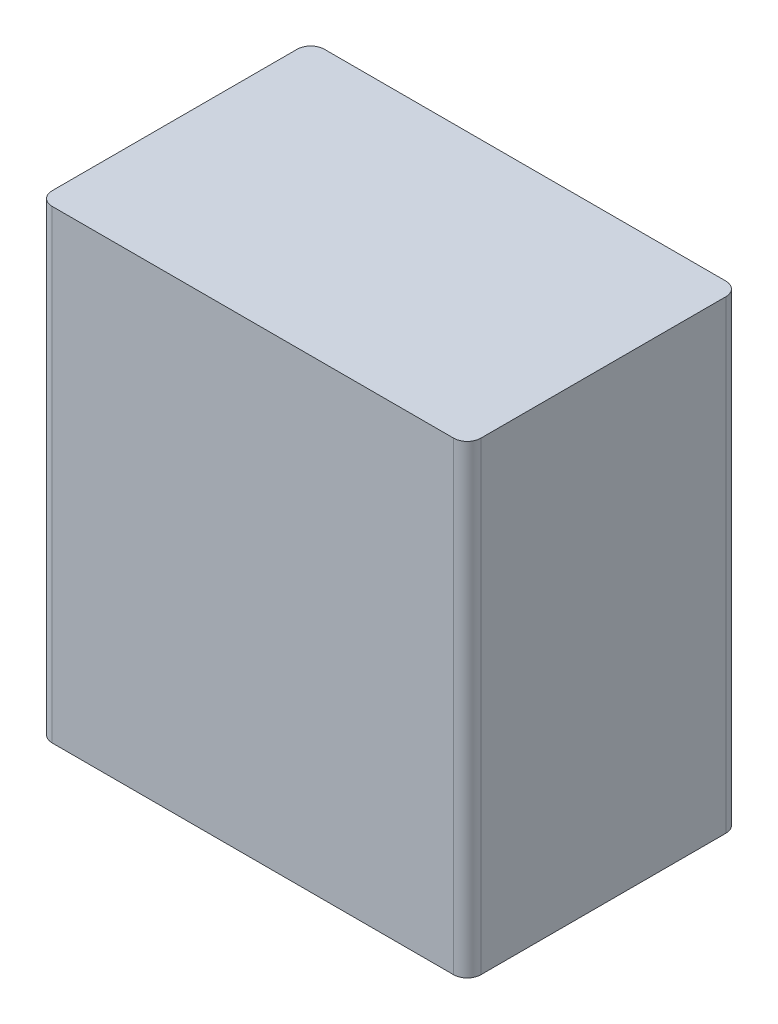
ISO-10303-21;
HEADER;
FILE_DESCRIPTION(('STEP AP214'),'2;1');
FILE_NAME('part.step','',(''),(''),'','','');
FILE_SCHEMA(('AUTOMOTIVE_DESIGN { 1 0 10303 214 1 1 1 1 }'));
ENDSEC;
DATA;
#1=APPLICATION_CONTEXT('core data for automotive mechanical design processes');
#2=APPLICATION_PROTOCOL_DEFINITION('international standard','automotive_design',2000,#1);
#3=PRODUCT_CONTEXT('',#1,'mechanical');
#4=PRODUCT('Part','Part','',(#3));
#5=PRODUCT_RELATED_PRODUCT_CATEGORY('part','',(#4));
#6=PRODUCT_DEFINITION_FORMATION('','',#4);
#7=PRODUCT_DEFINITION_CONTEXT('part definition',#1,'design');
#8=PRODUCT_DEFINITION('design','',#6,#7);
#9=PRODUCT_DEFINITION_SHAPE('','',#8);
#10=(LENGTH_UNIT() NAMED_UNIT(*) SI_UNIT(.MILLI.,.METRE.));
#11=(NAMED_UNIT(*) PLANE_ANGLE_UNIT() SI_UNIT($,.RADIAN.));
#12=(NAMED_UNIT(*) SI_UNIT($,.STERADIAN.) SOLID_ANGLE_UNIT());
#13=UNCERTAINTY_MEASURE_WITH_UNIT(LENGTH_MEASURE(1.E-05),#10,'distance_accuracy_value','');
#14=(GEOMETRIC_REPRESENTATION_CONTEXT(3) GLOBAL_UNCERTAINTY_ASSIGNED_CONTEXT((#13)) GLOBAL_UNIT_ASSIGNED_CONTEXT((#10,
#11,#12)) REPRESENTATION_CONTEXT('',''));
#15=CARTESIAN_POINT('',(0.,0.,0.));
#16=DIRECTION('',(0.,0.,1.));
#17=DIRECTION('',(1.,0.,0.));
#18=AXIS2_PLACEMENT_3D('',#15,#16,#17);
#19=CARTESIAN_POINT('',(0.,68.3,40.));
#20=DIRECTION('',(1.,0.,0.));
#21=DIRECTION('',(0.,0.,-1.));
#22=AXIS2_PLACEMENT_3D('',#19,#20,#21);
#23=PLANE('',#22);
#24=DIRECTION('',(0.,0.,-1.));
#25=VECTOR('',#24,1.);
#26=CARTESIAN_POINT('',(0.,68.3,40.));
#27=LINE('',#26,#25);
#28=CARTESIAN_POINT('',(0.,68.3,38.));
#29=VERTEX_POINT('',#28);
#30=CARTESIAN_POINT('',(0.,68.3,2.));
#31=VERTEX_POINT('',#30);
#32=EDGE_CURVE('E160',#29,#31,#27,.T.);
#33=ORIENTED_EDGE('',*,*,#32,.T.);
#34=DIRECTION('',(0.,-1.,0.));
#35=VECTOR('',#34,1.);
#36=CARTESIAN_POINT('',(0.,68.3,2.));
#37=LINE('',#36,#35);
#38=CARTESIAN_POINT('',(0.,0.,2.));
#39=VERTEX_POINT('',#38);
#40=EDGE_CURVE('E124',#31,#39,#37,.T.);
#41=ORIENTED_EDGE('',*,*,#40,.T.);
#42=DIRECTION('',(0.,0.,-1.));
#43=VECTOR('',#42,1.);
#44=CARTESIAN_POINT('',(0.,0.,40.));
#45=LINE('',#44,#43);
#46=CARTESIAN_POINT('',(0.,0.,38.));
#47=VERTEX_POINT('',#46);
#48=EDGE_CURVE('E109',#47,#39,#45,.T.);
#49=ORIENTED_EDGE('',*,*,#48,.F.);
#50=DIRECTION('',(0.,-1.,0.));
#51=VECTOR('',#50,1.);
#52=CARTESIAN_POINT('',(0.,68.3,38.));
#53=LINE('',#52,#51);
#54=EDGE_CURVE('E121',#47,#29,#53,.F.);
#55=ORIENTED_EDGE('',*,*,#54,.T.);
#56=EDGE_LOOP('',(#33,#41,#49,#55));
#57=FACE_BOUND('',#56,.T.);
#58=ADVANCED_FACE('F39',(#57),#23,.F.);
#59=CARTESIAN_POINT('',(0.,0.,40.));
#60=DIRECTION('',(0.,1.,0.));
#61=DIRECTION('',(0.,0.,1.));
#62=AXIS2_PLACEMENT_3D('',#59,#60,#61);
#63=PLANE('',#62);
#64=ORIENTED_EDGE('',*,*,#48,.T.);
#65=CARTESIAN_POINT('',(2.,0.,2.));
#66=DIRECTION('',(0.,1.,0.));
#67=DIRECTION('',(0.,0.,1.));
#68=AXIS2_PLACEMENT_3D('',#65,#66,#67);
#69=CIRCLE('',#68,2.);
#70=CARTESIAN_POINT('',(2.,0.,0.));
#71=VERTEX_POINT('',#70);
#72=EDGE_CURVE('E136',#39,#71,#69,.F.);
#73=ORIENTED_EDGE('',*,*,#72,.T.);
#74=DIRECTION('',(1.,0.,0.));
#75=VECTOR('',#74,1.);
#76=CARTESIAN_POINT('',(0.,0.,0.));
#77=LINE('',#76,#75);
#78=CARTESIAN_POINT('',(61.,0.,0.));
#79=VERTEX_POINT('',#78);
#80=EDGE_CURVE('E167',#71,#79,#77,.T.);
#81=ORIENTED_EDGE('',*,*,#80,.T.);
#82=CARTESIAN_POINT('',(61.,0.,2.));
#83=DIRECTION('',(0.,1.,0.));
#84=DIRECTION('',(0.,0.,1.));
#85=AXIS2_PLACEMENT_3D('',#82,#83,#84);
#86=CIRCLE('',#85,2.);
#87=CARTESIAN_POINT('',(63.,0.,2.));
#88=VERTEX_POINT('',#87);
#89=EDGE_CURVE('E115',#79,#88,#86,.F.);
#90=ORIENTED_EDGE('',*,*,#89,.T.);
#91=DIRECTION('',(0.,0.,-1.));
#92=VECTOR('',#91,1.);
#93=CARTESIAN_POINT('',(63.,0.,40.));
#94=LINE('',#93,#92);
#95=CARTESIAN_POINT('',(63.,0.,38.));
#96=VERTEX_POINT('',#95);
#97=EDGE_CURVE('E125',#96,#88,#94,.T.);
#98=ORIENTED_EDGE('',*,*,#97,.F.);
#99=CARTESIAN_POINT('',(61.,0.,38.));
#100=DIRECTION('',(0.,1.,0.));
#101=DIRECTION('',(0.,0.,1.));
#102=AXIS2_PLACEMENT_3D('',#99,#100,#101);
#103=CIRCLE('',#102,2.);
#104=CARTESIAN_POINT('',(61.,0.,40.));
#105=VERTEX_POINT('',#104);
#106=EDGE_CURVE('E116',#96,#105,#103,.F.);
#107=ORIENTED_EDGE('',*,*,#106,.T.);
#108=DIRECTION('',(1.,0.,0.));
#109=VECTOR('',#108,1.);
#110=CARTESIAN_POINT('',(0.,0.,40.));
#111=LINE('',#110,#109);
#112=CARTESIAN_POINT('',(2.,0.,40.));
#113=VERTEX_POINT('',#112);
#114=EDGE_CURVE('E111',#113,#105,#111,.T.);
#115=ORIENTED_EDGE('',*,*,#114,.F.);
#116=CARTESIAN_POINT('',(2.,0.,38.));
#117=DIRECTION('',(0.,1.,0.));
#118=DIRECTION('',(0.,0.,1.));
#119=AXIS2_PLACEMENT_3D('',#116,#117,#118);
#120=CIRCLE('',#119,2.);
#121=EDGE_CURVE('E106',#113,#47,#120,.F.);
#122=ORIENTED_EDGE('',*,*,#121,.T.);
#123=EDGE_LOOP('',(#64,#73,#81,#90,#98,#107,#115,#122));
#124=FACE_BOUND('',#123,.T.);
#125=ADVANCED_FACE('F108',(#124),#63,.F.);
#126=CARTESIAN_POINT('',(63.,0.,40.));
#127=DIRECTION('',(-1.,0.,0.));
#128=DIRECTION('',(0.,0.,1.));
#129=AXIS2_PLACEMENT_3D('',#126,#127,#128);
#130=PLANE('',#129);
#131=ORIENTED_EDGE('',*,*,#97,.T.);
#132=DIRECTION('',(0.,1.,0.));
#133=VECTOR('',#132,1.);
#134=CARTESIAN_POINT('',(63.,0.,2.));
#135=LINE('',#134,#133);
#136=CARTESIAN_POINT('',(63.,68.3,2.));
#137=VERTEX_POINT('',#136);
#138=EDGE_CURVE('E149',#88,#137,#135,.T.);
#139=ORIENTED_EDGE('',*,*,#138,.T.);
#140=DIRECTION('',(0.,0.,-1.));
#141=VECTOR('',#140,1.);
#142=CARTESIAN_POINT('',(63.,68.3,40.));
#143=LINE('',#142,#141);
#144=CARTESIAN_POINT('',(63.,68.3,38.));
#145=VERTEX_POINT('',#144);
#146=EDGE_CURVE('E162',#145,#137,#143,.T.);
#147=ORIENTED_EDGE('',*,*,#146,.F.);
#148=DIRECTION('',(0.,1.,0.));
#149=VECTOR('',#148,1.);
#150=CARTESIAN_POINT('',(63.,0.,38.));
#151=LINE('',#150,#149);
#152=EDGE_CURVE('E147',#145,#96,#151,.F.);
#153=ORIENTED_EDGE('',*,*,#152,.T.);
#154=EDGE_LOOP('',(#131,#139,#147,#153));
#155=FACE_BOUND('',#154,.T.);
#156=ADVANCED_FACE('F174',(#155),#130,.F.);
#157=CARTESIAN_POINT('',(63.,68.3,40.));
#158=DIRECTION('',(0.,-1.,0.));
#159=DIRECTION('',(0.,0.,-1.));
#160=AXIS2_PLACEMENT_3D('',#157,#158,#159);
#161=PLANE('',#160);
#162=DIRECTION('',(-1.,0.,0.));
#163=VECTOR('',#162,1.);
#164=CARTESIAN_POINT('',(63.,68.3,0.));
#165=LINE('',#164,#163);
#166=CARTESIAN_POINT('',(61.,68.3,0.));
#167=VERTEX_POINT('',#166);
#168=CARTESIAN_POINT('',(2.,68.3,0.));
#169=VERTEX_POINT('',#168);
#170=EDGE_CURVE('E164',#167,#169,#165,.T.);
#171=ORIENTED_EDGE('',*,*,#170,.T.);
#172=CARTESIAN_POINT('',(2.,68.3,2.));
#173=DIRECTION('',(0.,-1.,0.));
#174=DIRECTION('',(0.,0.,-1.));
#175=AXIS2_PLACEMENT_3D('',#172,#173,#174);
#176=CIRCLE('',#175,2.);
#177=EDGE_CURVE('E145',#169,#31,#176,.F.);
#178=ORIENTED_EDGE('',*,*,#177,.T.);
#179=ORIENTED_EDGE('',*,*,#32,.F.);
#180=CARTESIAN_POINT('',(2.,68.3,38.));
#181=DIRECTION('',(0.,-1.,0.));
#182=DIRECTION('',(0.,0.,-1.));
#183=AXIS2_PLACEMENT_3D('',#180,#181,#182);
#184=CIRCLE('',#183,2.);
#185=CARTESIAN_POINT('',(2.,68.3,40.));
#186=VERTEX_POINT('',#185);
#187=EDGE_CURVE('E129',#29,#186,#184,.F.);
#188=ORIENTED_EDGE('',*,*,#187,.T.);
#189=DIRECTION('',(-1.,0.,0.));
#190=VECTOR('',#189,1.);
#191=CARTESIAN_POINT('',(63.,68.3,40.));
#192=LINE('',#191,#190);
#193=CARTESIAN_POINT('',(61.,68.3,40.));
#194=VERTEX_POINT('',#193);
#195=EDGE_CURVE('E155',#194,#186,#192,.T.);
#196=ORIENTED_EDGE('',*,*,#195,.F.);
#197=CARTESIAN_POINT('',(61.,68.3,38.));
#198=DIRECTION('',(0.,-1.,0.));
#199=DIRECTION('',(0.,0.,-1.));
#200=AXIS2_PLACEMENT_3D('',#197,#198,#199);
#201=CIRCLE('',#200,2.);
#202=EDGE_CURVE('E62',#194,#145,#201,.F.);
#203=ORIENTED_EDGE('',*,*,#202,.T.);
#204=ORIENTED_EDGE('',*,*,#146,.T.);
#205=CARTESIAN_POINT('',(61.,68.3,2.));
#206=DIRECTION('',(0.,-1.,0.));
#207=DIRECTION('',(0.,0.,-1.));
#208=AXIS2_PLACEMENT_3D('',#205,#206,#207);
#209=CIRCLE('',#208,2.);
#210=EDGE_CURVE('E54',#137,#167,#209,.F.);
#211=ORIENTED_EDGE('',*,*,#210,.T.);
#212=EDGE_LOOP('',(#171,#178,#179,#188,#196,#203,#204,#211));
#213=FACE_BOUND('',#212,.T.);
#214=ADVANCED_FACE('F159',(#213),#161,.F.);
#215=CARTESIAN_POINT('',(0.,0.,40.));
#216=DIRECTION('',(0.,0.,1.));
#217=DIRECTION('',(1.,0.,0.));
#218=AXIS2_PLACEMENT_3D('',#215,#216,#217);
#219=PLANE('',#218);
#220=ORIENTED_EDGE('',*,*,#195,.T.);
#221=DIRECTION('',(0.,-1.,0.));
#222=VECTOR('',#221,1.);
#223=CARTESIAN_POINT('',(2.,0.,40.));
#224=LINE('',#223,#222);
#225=EDGE_CURVE('E11',#186,#113,#224,.T.);
#226=ORIENTED_EDGE('',*,*,#225,.T.);
#227=ORIENTED_EDGE('',*,*,#114,.T.);
#228=DIRECTION('',(0.,1.,0.));
#229=VECTOR('',#228,1.);
#230=CARTESIAN_POINT('',(61.,68.3,40.));
#231=LINE('',#230,#229);
#232=EDGE_CURVE('E47',#105,#194,#231,.T.);
#233=ORIENTED_EDGE('',*,*,#232,.T.);
#234=EDGE_LOOP('',(#220,#226,#227,#233));
#235=FACE_BOUND('',#234,.T.);
#236=ADVANCED_FACE('F154',(#235),#219,.T.);
#237=CARTESIAN_POINT('',(0.,0.,0.));
#238=DIRECTION('',(0.,0.,1.));
#239=DIRECTION('',(1.,0.,0.));
#240=AXIS2_PLACEMENT_3D('',#237,#238,#239);
#241=PLANE('',#240);
#242=ORIENTED_EDGE('',*,*,#80,.F.);
#243=DIRECTION('',(0.,-1.,0.));
#244=VECTOR('',#243,1.);
#245=CARTESIAN_POINT('',(2.,0.,0.));
#246=LINE('',#245,#244);
#247=EDGE_CURVE('E140',#71,#169,#246,.F.);
#248=ORIENTED_EDGE('',*,*,#247,.T.);
#249=ORIENTED_EDGE('',*,*,#170,.F.);
#250=DIRECTION('',(0.,1.,0.));
#251=VECTOR('',#250,1.);
#252=CARTESIAN_POINT('',(61.,0.,0.));
#253=LINE('',#252,#251);
#254=EDGE_CURVE('E138',#167,#79,#253,.F.);
#255=ORIENTED_EDGE('',*,*,#254,.T.);
#256=EDGE_LOOP('',(#242,#248,#249,#255));
#257=FACE_BOUND('',#256,.T.);
#258=ADVANCED_FACE('F181',(#257),#241,.F.);
#259=CARTESIAN_POINT('',(2.,68.3,2.));
#260=DIRECTION('',(0.,-1.,0.));
#261=DIRECTION('',(0.,0.,-1.));
#262=AXIS2_PLACEMENT_3D('',#259,#260,#261);
#263=CYLINDRICAL_SURFACE('',#262,2.);
#264=ORIENTED_EDGE('',*,*,#177,.F.);
#265=ORIENTED_EDGE('',*,*,#247,.F.);
#266=ORIENTED_EDGE('',*,*,#72,.F.);
#267=ORIENTED_EDGE('',*,*,#40,.F.);
#268=EDGE_LOOP('',(#264,#265,#266,#267));
#269=FACE_BOUND('',#268,.T.);
#270=ADVANCED_FACE('F185',(#269),#263,.T.);
#271=CARTESIAN_POINT('',(61.,0.,2.));
#272=DIRECTION('',(0.,1.,0.));
#273=DIRECTION('',(0.,0.,1.));
#274=AXIS2_PLACEMENT_3D('',#271,#272,#273);
#275=CYLINDRICAL_SURFACE('',#274,2.);
#276=ORIENTED_EDGE('',*,*,#89,.F.);
#277=ORIENTED_EDGE('',*,*,#254,.F.);
#278=ORIENTED_EDGE('',*,*,#210,.F.);
#279=ORIENTED_EDGE('',*,*,#138,.F.);
#280=EDGE_LOOP('',(#276,#277,#278,#279));
#281=FACE_BOUND('',#280,.T.);
#282=ADVANCED_FACE('F177',(#281),#275,.T.);
#283=CARTESIAN_POINT('',(2.,0.,38.));
#284=DIRECTION('',(0.,1.,0.));
#285=DIRECTION('',(0.,0.,1.));
#286=AXIS2_PLACEMENT_3D('',#283,#284,#285);
#287=CYLINDRICAL_SURFACE('',#286,2.);
#288=ORIENTED_EDGE('',*,*,#187,.F.);
#289=ORIENTED_EDGE('',*,*,#54,.F.);
#290=ORIENTED_EDGE('',*,*,#121,.F.);
#291=ORIENTED_EDGE('',*,*,#225,.F.);
#292=EDGE_LOOP('',(#288,#289,#290,#291));
#293=FACE_BOUND('',#292,.T.);
#294=ADVANCED_FACE('F128',(#293),#287,.T.);
#295=CARTESIAN_POINT('',(61.,0.,38.));
#296=DIRECTION('',(0.,-1.,0.));
#297=DIRECTION('',(0.,0.,-1.));
#298=AXIS2_PLACEMENT_3D('',#295,#296,#297);
#299=CYLINDRICAL_SURFACE('',#298,2.);
#300=ORIENTED_EDGE('',*,*,#106,.F.);
#301=ORIENTED_EDGE('',*,*,#152,.F.);
#302=ORIENTED_EDGE('',*,*,#202,.F.);
#303=ORIENTED_EDGE('',*,*,#232,.F.);
#304=EDGE_LOOP('',(#300,#301,#302,#303));
#305=FACE_BOUND('',#304,.T.);
#306=ADVANCED_FACE('F41',(#305),#299,.T.);
#307=CLOSED_SHELL('',(#58,#125,#156,#214,#236,#258,#270,#282,#294,#306));
#308=MANIFOLD_SOLID_BREP('B2',#307);
#309=ADVANCED_BREP_SHAPE_REPRESENTATION('',(#18,#308),#14);
#310=SHAPE_DEFINITION_REPRESENTATION(#9,#309);
ENDSEC;
END-ISO-10303-21;
